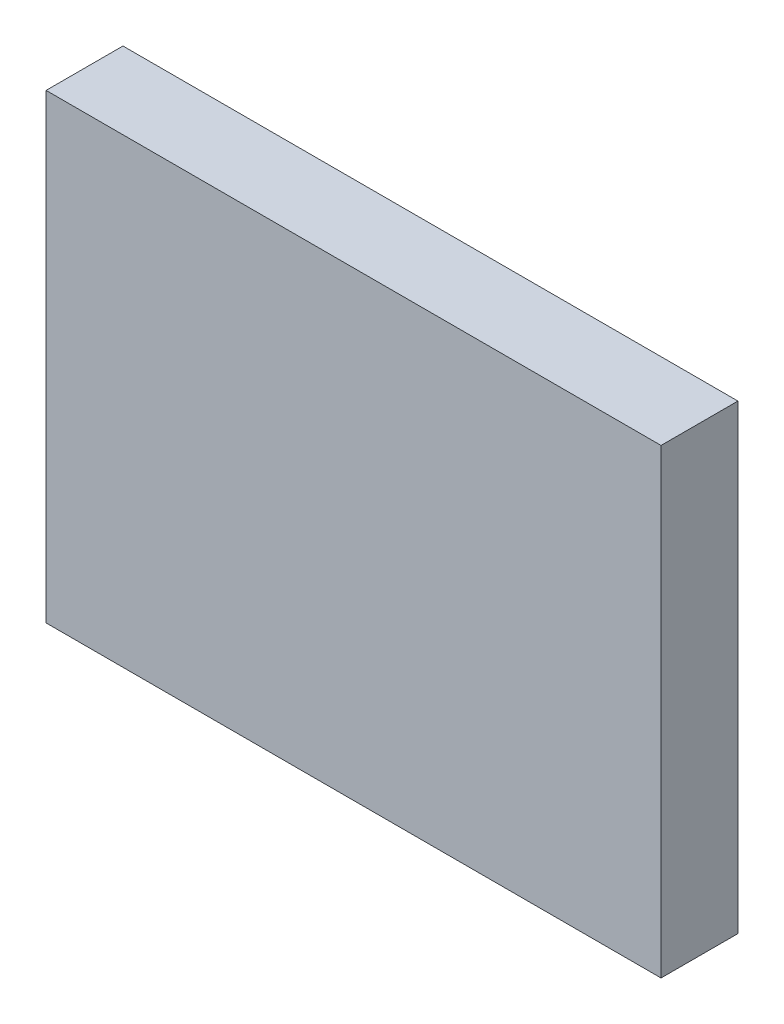
ISO-10303-21;
HEADER;
FILE_DESCRIPTION(('STEP AP214'),'2;1');
FILE_NAME('part.step','',(''),(''),'','','');
FILE_SCHEMA(('AUTOMOTIVE_DESIGN { 1 0 10303 214 1 1 1 1 }'));
ENDSEC;
DATA;
#1=APPLICATION_CONTEXT('core data for automotive mechanical design processes');
#2=APPLICATION_PROTOCOL_DEFINITION('international standard','automotive_design',2000,#1);
#3=PRODUCT_CONTEXT('',#1,'mechanical');
#4=PRODUCT('Part','Part','',(#3));
#5=PRODUCT_RELATED_PRODUCT_CATEGORY('part','',(#4));
#6=PRODUCT_DEFINITION_FORMATION('','',#4);
#7=PRODUCT_DEFINITION_CONTEXT('part definition',#1,'design');
#8=PRODUCT_DEFINITION('design','',#6,#7);
#9=PRODUCT_DEFINITION_SHAPE('','',#8);
#10=(LENGTH_UNIT() NAMED_UNIT(*) SI_UNIT(.MILLI.,.METRE.));
#11=(NAMED_UNIT(*) PLANE_ANGLE_UNIT() SI_UNIT($,.RADIAN.));
#12=(NAMED_UNIT(*) SI_UNIT($,.STERADIAN.) SOLID_ANGLE_UNIT());
#13=UNCERTAINTY_MEASURE_WITH_UNIT(LENGTH_MEASURE(1.E-05),#10,'distance_accuracy_value','');
#14=(GEOMETRIC_REPRESENTATION_CONTEXT(3) GLOBAL_UNCERTAINTY_ASSIGNED_CONTEXT((#13)) GLOBAL_UNIT_ASSIGNED_CONTEXT((#10,
#11,#12)) REPRESENTATION_CONTEXT('',''));
#15=CARTESIAN_POINT('',(0.,0.,0.));
#16=DIRECTION('',(0.,0.,1.));
#17=DIRECTION('',(1.,0.,0.));
#18=AXIS2_PLACEMENT_3D('',#15,#16,#17);
#19=CARTESIAN_POINT('',(0.,0.,12.7));
#20=DIRECTION('',(1.,0.,0.));
#21=DIRECTION('',(0.,0.,-1.));
#22=AXIS2_PLACEMENT_3D('',#19,#20,#21);
#23=PLANE('',#22);
#24=DIRECTION('',(0.,-1.,0.));
#25=VECTOR('',#24,1.);
#26=CARTESIAN_POINT('',(0.,0.,0.));
#27=LINE('',#26,#25);
#28=CARTESIAN_POINT('',(0.,76.2,0.));
#29=VERTEX_POINT('',#28);
#30=CARTESIAN_POINT('',(0.,0.,0.));
#31=VERTEX_POINT('',#30);
#32=EDGE_CURVE('E105',#29,#31,#27,.T.);
#33=ORIENTED_EDGE('',*,*,#32,.T.);
#34=DIRECTION('',(0.,0.,-1.));
#35=VECTOR('',#34,1.);
#36=CARTESIAN_POINT('',(0.,0.,12.7));
#37=LINE('',#36,#35);
#38=CARTESIAN_POINT('',(0.,0.,12.7));
#39=VERTEX_POINT('',#38);
#40=EDGE_CURVE('E11',#39,#31,#37,.T.);
#41=ORIENTED_EDGE('',*,*,#40,.F.);
#42=DIRECTION('',(0.,-1.,0.));
#43=VECTOR('',#42,1.);
#44=CARTESIAN_POINT('',(0.,0.,12.7));
#45=LINE('',#44,#43);
#46=CARTESIAN_POINT('',(0.,76.2,12.7));
#47=VERTEX_POINT('',#46);
#48=EDGE_CURVE('E89',#47,#39,#45,.T.);
#49=ORIENTED_EDGE('',*,*,#48,.F.);
#50=DIRECTION('',(0.,0.,-1.));
#51=VECTOR('',#50,1.);
#52=CARTESIAN_POINT('',(0.,76.2,12.7));
#53=LINE('',#52,#51);
#54=EDGE_CURVE('E97',#47,#29,#53,.T.);
#55=ORIENTED_EDGE('',*,*,#54,.T.);
#56=EDGE_LOOP('',(#33,#41,#49,#55));
#57=FACE_BOUND('',#56,.T.);
#58=ADVANCED_FACE('F39',(#57),#23,.F.);
#59=CARTESIAN_POINT('',(0.,0.,12.7));
#60=DIRECTION('',(0.,1.,0.));
#61=DIRECTION('',(0.,0.,1.));
#62=AXIS2_PLACEMENT_3D('',#59,#60,#61);
#63=PLANE('',#62);
#64=DIRECTION('',(1.,0.,0.));
#65=VECTOR('',#64,1.);
#66=CARTESIAN_POINT('',(0.,0.,0.));
#67=LINE('',#66,#65);
#68=CARTESIAN_POINT('',(101.6,0.,0.));
#69=VERTEX_POINT('',#68);
#70=EDGE_CURVE('E92',#31,#69,#67,.T.);
#71=ORIENTED_EDGE('',*,*,#70,.T.);
#72=DIRECTION('',(0.,0.,-1.));
#73=VECTOR('',#72,1.);
#74=CARTESIAN_POINT('',(101.6,0.,12.7));
#75=LINE('',#74,#73);
#76=CARTESIAN_POINT('',(101.6,0.,12.7));
#77=VERTEX_POINT('',#76);
#78=EDGE_CURVE('E50',#77,#69,#75,.T.);
#79=ORIENTED_EDGE('',*,*,#78,.F.);
#80=DIRECTION('',(1.,0.,0.));
#81=VECTOR('',#80,1.);
#82=CARTESIAN_POINT('',(0.,0.,12.7));
#83=LINE('',#82,#81);
#84=EDGE_CURVE('E82',#39,#77,#83,.T.);
#85=ORIENTED_EDGE('',*,*,#84,.F.);
#86=ORIENTED_EDGE('',*,*,#40,.T.);
#87=EDGE_LOOP('',(#71,#79,#85,#86));
#88=FACE_BOUND('',#87,.T.);
#89=ADVANCED_FACE('F93',(#88),#63,.F.);
#90=CARTESIAN_POINT('',(101.6,0.,12.7));
#91=DIRECTION('',(-1.,0.,0.));
#92=DIRECTION('',(0.,0.,1.));
#93=AXIS2_PLACEMENT_3D('',#90,#91,#92);
#94=PLANE('',#93);
#95=DIRECTION('',(0.,1.,0.));
#96=VECTOR('',#95,1.);
#97=CARTESIAN_POINT('',(101.6,0.,0.));
#98=LINE('',#97,#96);
#99=CARTESIAN_POINT('',(101.6,76.2,0.));
#100=VERTEX_POINT('',#99);
#101=EDGE_CURVE('E74',#69,#100,#98,.T.);
#102=ORIENTED_EDGE('',*,*,#101,.T.);
#103=DIRECTION('',(0.,0.,-1.));
#104=VECTOR('',#103,1.);
#105=CARTESIAN_POINT('',(101.6,76.2,12.7));
#106=LINE('',#105,#104);
#107=CARTESIAN_POINT('',(101.6,76.2,12.7));
#108=VERTEX_POINT('',#107);
#109=EDGE_CURVE('E94',#108,#100,#106,.T.);
#110=ORIENTED_EDGE('',*,*,#109,.F.);
#111=DIRECTION('',(0.,1.,0.));
#112=VECTOR('',#111,1.);
#113=CARTESIAN_POINT('',(101.6,0.,12.7));
#114=LINE('',#113,#112);
#115=EDGE_CURVE('E88',#77,#108,#114,.T.);
#116=ORIENTED_EDGE('',*,*,#115,.F.);
#117=ORIENTED_EDGE('',*,*,#78,.T.);
#118=EDGE_LOOP('',(#102,#110,#116,#117));
#119=FACE_BOUND('',#118,.T.);
#120=ADVANCED_FACE('F96',(#119),#94,.F.);
#121=CARTESIAN_POINT('',(0.,76.2,12.7));
#122=DIRECTION('',(0.,-1.,0.));
#123=DIRECTION('',(0.,0.,-1.));
#124=AXIS2_PLACEMENT_3D('',#121,#122,#123);
#125=PLANE('',#124);
#126=DIRECTION('',(-1.,0.,0.));
#127=VECTOR('',#126,1.);
#128=CARTESIAN_POINT('',(0.,76.2,0.));
#129=LINE('',#128,#127);
#130=EDGE_CURVE('E76',#100,#29,#129,.T.);
#131=ORIENTED_EDGE('',*,*,#130,.T.);
#132=ORIENTED_EDGE('',*,*,#54,.F.);
#133=DIRECTION('',(-1.,0.,0.));
#134=VECTOR('',#133,1.);
#135=CARTESIAN_POINT('',(0.,76.2,12.7));
#136=LINE('',#135,#134);
#137=EDGE_CURVE('E54',#108,#47,#136,.T.);
#138=ORIENTED_EDGE('',*,*,#137,.F.);
#139=ORIENTED_EDGE('',*,*,#109,.T.);
#140=EDGE_LOOP('',(#131,#132,#138,#139));
#141=FACE_BOUND('',#140,.T.);
#142=ADVANCED_FACE('F106',(#141),#125,.F.);
#143=CARTESIAN_POINT('',(0.,0.,12.7));
#144=DIRECTION('',(0.,0.,-1.));
#145=DIRECTION('',(-1.,0.,0.));
#146=AXIS2_PLACEMENT_3D('',#143,#144,#145);
#147=PLANE('',#146);
#148=ORIENTED_EDGE('',*,*,#48,.T.);
#149=ORIENTED_EDGE('',*,*,#84,.T.);
#150=ORIENTED_EDGE('',*,*,#115,.T.);
#151=ORIENTED_EDGE('',*,*,#137,.T.);
#152=EDGE_LOOP('',(#148,#149,#150,#151));
#153=FACE_BOUND('',#152,.T.);
#154=ADVANCED_FACE('F86',(#153),#147,.F.);
#155=CARTESIAN_POINT('',(0.,0.,0.));
#156=DIRECTION('',(0.,0.,-1.));
#157=DIRECTION('',(-1.,0.,0.));
#158=AXIS2_PLACEMENT_3D('',#155,#156,#157);
#159=PLANE('',#158);
#160=ORIENTED_EDGE('',*,*,#32,.F.);
#161=ORIENTED_EDGE('',*,*,#130,.F.);
#162=ORIENTED_EDGE('',*,*,#101,.F.);
#163=ORIENTED_EDGE('',*,*,#70,.F.);
#164=EDGE_LOOP('',(#160,#161,#162,#163));
#165=FACE_BOUND('',#164,.T.);
#166=ADVANCED_FACE('F115',(#165),#159,.T.);
#167=CLOSED_SHELL('',(#58,#89,#120,#142,#154,#166));
#168=MANIFOLD_SOLID_BREP('B2',#167);
#169=ADVANCED_BREP_SHAPE_REPRESENTATION('',(#18,#168),#14);
#170=SHAPE_DEFINITION_REPRESENTATION(#9,#169);
ENDSEC;
END-ISO-10303-21;
